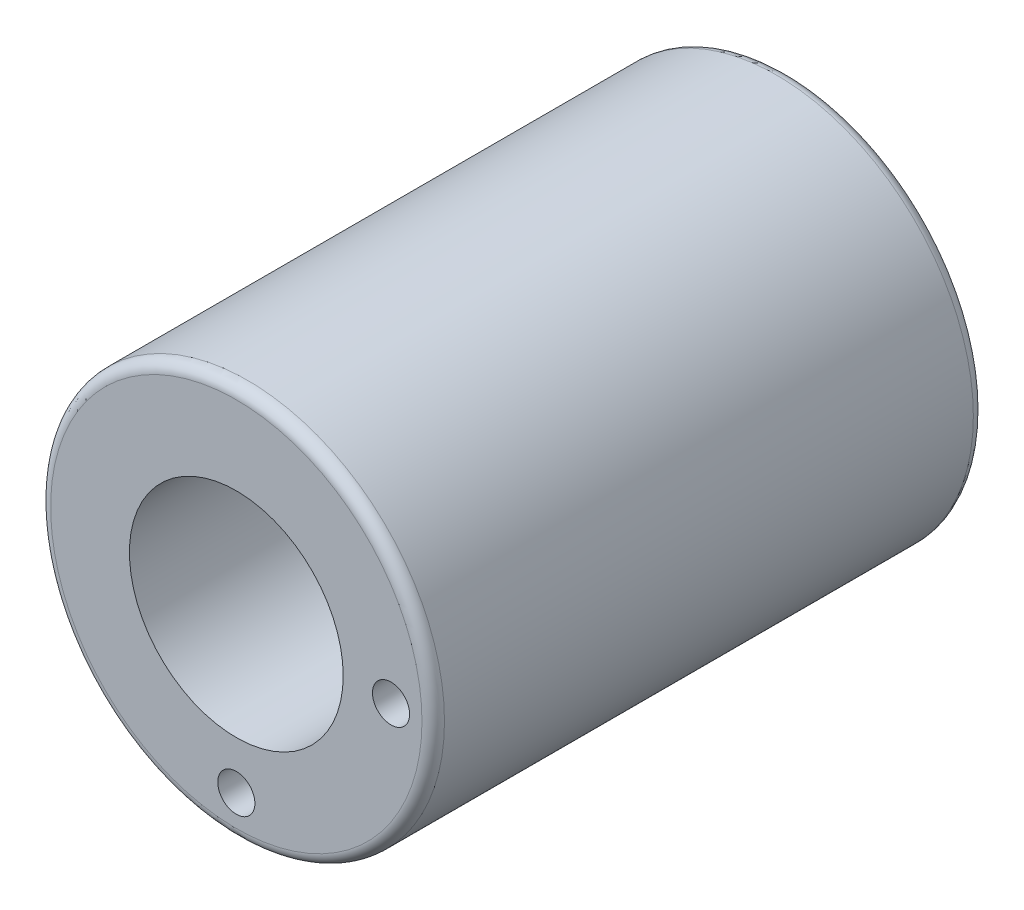
ISO-10303-21;
HEADER;
FILE_DESCRIPTION(('STEP AP214'),'2;1');
FILE_NAME('part.step','',(''),(''),'','','');
FILE_SCHEMA(('AUTOMOTIVE_DESIGN { 1 0 10303 214 1 1 1 1 }'));
ENDSEC;
DATA;
#1=APPLICATION_CONTEXT('core data for automotive mechanical design processes');
#2=APPLICATION_PROTOCOL_DEFINITION('international standard','automotive_design',2000,#1);
#3=PRODUCT_CONTEXT('',#1,'mechanical');
#4=PRODUCT('Part','Part','',(#3));
#5=PRODUCT_RELATED_PRODUCT_CATEGORY('part','',(#4));
#6=PRODUCT_DEFINITION_FORMATION('','',#4);
#7=PRODUCT_DEFINITION_CONTEXT('part definition',#1,'design');
#8=PRODUCT_DEFINITION('design','',#6,#7);
#9=PRODUCT_DEFINITION_SHAPE('','',#8);
#10=(LENGTH_UNIT() NAMED_UNIT(*) SI_UNIT(.MILLI.,.METRE.));
#11=(NAMED_UNIT(*) PLANE_ANGLE_UNIT() SI_UNIT($,.RADIAN.));
#12=(NAMED_UNIT(*) SI_UNIT($,.STERADIAN.) SOLID_ANGLE_UNIT());
#13=UNCERTAINTY_MEASURE_WITH_UNIT(LENGTH_MEASURE(1.E-05),#10,'distance_accuracy_value','');
#14=(GEOMETRIC_REPRESENTATION_CONTEXT(3) GLOBAL_UNCERTAINTY_ASSIGNED_CONTEXT((#13)) GLOBAL_UNIT_ASSIGNED_CONTEXT((#10,
#11,#12)) REPRESENTATION_CONTEXT('',''));
#15=CARTESIAN_POINT('',(0.,0.,0.));
#16=DIRECTION('',(0.,0.,1.));
#17=DIRECTION('',(1.,0.,0.));
#18=AXIS2_PLACEMENT_3D('',#15,#16,#17);
#19=CARTESIAN_POINT('',(0.,0.,24.5));
#20=DIRECTION('',(0.,0.,1.));
#21=DIRECTION('',(1.,0.,0.));
#22=AXIS2_PLACEMENT_3D('',#19,#20,#21);
#23=PLANE('',#22);
#24=CARTESIAN_POINT('',(13.75,0.,24.5));
#25=DIRECTION('',(0.,0.,1.));
#26=DIRECTION('',(1.,0.,0.));
#27=AXIS2_PLACEMENT_3D('',#24,#25,#26);
#28=CIRCLE('',#27,1.64999999999999);
#29=CARTESIAN_POINT('',(15.4,0.,24.5));
#30=VERTEX_POINT('',#29);
#31=EDGE_CURVE('E67',#30,#30,#28,.T.);
#32=ORIENTED_EDGE('',*,*,#31,.F.);
#33=EDGE_LOOP('',(#32));
#34=FACE_BOUND('',#33,.T.);
#35=CARTESIAN_POINT('',(0.,-13.75,24.5));
#36=DIRECTION('',(0.,0.,1.));
#37=DIRECTION('',(1.,0.,0.));
#38=AXIS2_PLACEMENT_3D('',#35,#36,#37);
#39=CIRCLE('',#38,1.64999999999999);
#40=CARTESIAN_POINT('',(1.64999999999999,-13.75,24.5));
#41=VERTEX_POINT('',#40);
#42=EDGE_CURVE('E66',#41,#41,#39,.T.);
#43=ORIENTED_EDGE('',*,*,#42,.F.);
#44=EDGE_LOOP('',(#43));
#45=FACE_BOUND('',#44,.T.);
#46=CARTESIAN_POINT('',(0.,0.,24.5));
#47=DIRECTION('',(0.,0.,1.));
#48=DIRECTION('',(1.,0.,0.));
#49=AXIS2_PLACEMENT_3D('',#46,#47,#48);
#50=CIRCLE('',#49,16.5);
#51=CARTESIAN_POINT('',(16.5,0.,24.5));
#52=VERTEX_POINT('',#51);
#53=EDGE_CURVE('E11',#52,#52,#50,.T.);
#54=ORIENTED_EDGE('',*,*,#53,.T.);
#55=EDGE_LOOP('',(#54));
#56=FACE_BOUND('',#55,.T.);
#57=CARTESIAN_POINT('',(0.,0.,24.5));
#58=DIRECTION('',(0.,0.,1.));
#59=DIRECTION('',(1.,0.,0.));
#60=AXIS2_PLACEMENT_3D('',#57,#58,#59);
#61=CIRCLE('',#60,9.5);
#62=CARTESIAN_POINT('',(9.5,0.,24.5));
#63=VERTEX_POINT('',#62);
#64=EDGE_CURVE('E85',#63,#63,#61,.T.);
#65=ORIENTED_EDGE('',*,*,#64,.F.);
#66=EDGE_LOOP('',(#65));
#67=FACE_BOUND('',#66,.T.);
#68=ADVANCED_FACE('F36',(#34,#45,#56,#67),#23,.T.);
#69=CARTESIAN_POINT('',(0.,0.,-24.5));
#70=DIRECTION('',(0.,0.,1.));
#71=DIRECTION('',(1.,0.,0.));
#72=AXIS2_PLACEMENT_3D('',#69,#70,#71);
#73=PLANE('',#72);
#74=CARTESIAN_POINT('',(0.,0.,-24.5));
#75=DIRECTION('',(0.,0.,1.));
#76=DIRECTION('',(1.,0.,0.));
#77=AXIS2_PLACEMENT_3D('',#74,#75,#76);
#78=CIRCLE('',#77,16.5);
#79=CARTESIAN_POINT('',(16.5,0.,-24.5));
#80=VERTEX_POINT('',#79);
#81=EDGE_CURVE('E50',#80,#80,#78,.F.);
#82=ORIENTED_EDGE('',*,*,#81,.T.);
#83=EDGE_LOOP('',(#82));
#84=FACE_BOUND('',#83,.T.);
#85=CARTESIAN_POINT('',(0.,0.,-24.5));
#86=DIRECTION('',(0.,0.,1.));
#87=DIRECTION('',(1.,0.,0.));
#88=AXIS2_PLACEMENT_3D('',#85,#86,#87);
#89=CIRCLE('',#88,9.5);
#90=CARTESIAN_POINT('',(9.5,0.,-24.5));
#91=VERTEX_POINT('',#90);
#92=EDGE_CURVE('E84',#91,#91,#89,.T.);
#93=ORIENTED_EDGE('',*,*,#92,.T.);
#94=EDGE_LOOP('',(#93));
#95=FACE_BOUND('',#94,.T.);
#96=ADVANCED_FACE('F105',(#84,#95),#73,.F.);
#97=CARTESIAN_POINT('',(0.,0.,24.5));
#98=DIRECTION('',(0.,0.,-1.));
#99=DIRECTION('',(-1.,0.,0.));
#100=AXIS2_PLACEMENT_3D('',#97,#98,#99);
#101=CYLINDRICAL_SURFACE('',#100,17.5);
#102=CARTESIAN_POINT('',(-17.5,0.,-6.5));
#103=CARTESIAN_POINT('',(-17.5000005449164,0.176082842707265,-6.50000074770926));
#104=CARTESIAN_POINT('',(-17.4973366738379,0.352155278135002,-6.49283950648984));
#105=CARTESIAN_POINT('',(-17.486753318283,0.703044903326908,-6.46426482195044));
#106=CARTESIAN_POINT('',(-17.4788320387425,0.877861643738105,-6.44284651075784));
#107=CARTESIAN_POINT('',(-17.4579514394268,1.22479386980598,-6.38598195476209));
#108=CARTESIAN_POINT('',(-17.4449947453772,1.39691071474323,-6.35054302086411));
#109=CARTESIAN_POINT('',(-17.4143827440417,1.73738363272554,-6.26596200028572));
#110=CARTESIAN_POINT('',(-17.3967256121107,1.90573821774471,-6.21681459180992));
#111=CARTESIAN_POINT('',(-17.3572230957471,2.23709286074898,-6.10539912216409));
#112=CARTESIAN_POINT('',(-17.3353875823091,2.40010449846399,-6.04316195053314));
#113=CARTESIAN_POINT('',(-17.2880490287416,2.72021162920226,-5.90599545734075));
#114=CARTESIAN_POINT('',(-17.2625446295057,2.87730490248572,-5.83106143050349));
#115=CARTESIAN_POINT('',(-17.2085140385072,3.18455243036811,-5.66910751078582));
#116=CARTESIAN_POINT('',(-17.1799883074179,3.33470773782323,-5.58208945977177));
#117=CARTESIAN_POINT('',(-17.1205990526509,3.62731113321308,-5.39653947305941));
#118=CARTESIAN_POINT('',(-17.0897346869112,3.76975641307936,-5.29800338311434));
#119=CARTESIAN_POINT('',(-17.0252346811939,4.05129807650965,-5.08617442065734));
#120=CARTESIAN_POINT('',(-16.9915385236593,4.19006863078621,-4.9724667708772));
#121=CARTESIAN_POINT('',(-16.9233143541839,4.45763362334577,-4.73409007097036));
#122=CARTESIAN_POINT('',(-16.8887863185188,4.58642777666906,-4.60942070795711));
#123=CARTESIAN_POINT('',(-16.8197845677912,4.83335188192489,-4.34980644565736));
#124=CARTESIAN_POINT('',(-16.7853108845324,4.95147696256481,-4.21485690395872));
#125=CARTESIAN_POINT('',(-16.7173639136864,5.17624644228479,-3.93555527200228));
#126=CARTESIAN_POINT('',(-16.6838902915793,5.2828947121282,-3.79120637837752));
#127=CARTESIAN_POINT('',(-16.6176223418041,5.48786535922025,-3.48826977611436));
#128=CARTESIAN_POINT('',(-16.5849012507242,5.58572200925672,-3.32935037193457));
#129=CARTESIAN_POINT('',(-16.5225337266652,5.76759245036644,-3.00328342353148));
#130=CARTESIAN_POINT('',(-16.4928860642893,5.85161178445879,-2.8361392090624));
#131=CARTESIAN_POINT('',(-16.4376051742514,6.00514775555873,-2.49464433654784));
#132=CARTESIAN_POINT('',(-16.4119724384089,6.07466261614641,-2.32029279892246));
#133=CARTESIAN_POINT('',(-16.3656100690415,6.19848225267279,-1.96572108830928));
#134=CARTESIAN_POINT('',(-16.3448780834452,6.25279432736706,-1.78550377799006));
#135=CARTESIAN_POINT('',(-16.3097586879032,6.3438203440804,-1.42780532423225));
#136=CARTESIAN_POINT('',(-16.2951508051844,6.38115091875057,-1.25050273533275));
#137=CARTESIAN_POINT('',(-16.2716273697111,6.44089881263929,-0.893101867924691));
#138=CARTESIAN_POINT('',(-16.2627093385055,6.46332262529549,-0.713004841715108));
#139=CARTESIAN_POINT('',(-16.2508716121865,6.4930292440554,-0.351394631266974));
#140=CARTESIAN_POINT('',(-16.2479510659561,6.50031419855116,-0.169881651640063));
#141=CARTESIAN_POINT('',(-16.2482108539265,6.49966505077263,0.193109165249485));
#142=CARTESIAN_POINT('',(-16.2513909577197,6.49173152326602,0.374587003580444));
#143=CARTESIAN_POINT('',(-16.2633727390578,6.4616519593851,0.725399087858757));
#144=CARTESIAN_POINT('',(-16.2718328569624,6.44036908886225,0.894819903621266));
#145=CARTESIAN_POINT('',(-16.293792665971,6.38460788212688,1.23120119134158));
#146=CARTESIAN_POINT('',(-16.3072940327803,6.35012515820263,1.39816082600241));
#147=CARTESIAN_POINT('',(-16.3389211823553,6.26829915425157,1.72839764484689));
#148=CARTESIAN_POINT('',(-16.3570457592211,6.22095922763854,1.89167577722993));
#149=CARTESIAN_POINT('',(-16.397397098282,6.11380761639349,2.21362895068428));
#150=CARTESIAN_POINT('',(-16.4196254282211,6.05399116425608,2.37230220566979));
#151=CARTESIAN_POINT('',(-16.4679944628653,5.92116893612842,2.68690229527894));
#152=CARTESIAN_POINT('',(-16.4941993088252,5.84794186705102,2.8427257631207));
#153=CARTESIAN_POINT('',(-16.5494920436118,5.6895822090298,3.14772815947756));
#154=CARTESIAN_POINT('',(-16.5785809117832,5.60444557182173,3.29690480579545));
#155=CARTESIAN_POINT('',(-16.6388656230188,5.42284991308396,3.58777051618573));
#156=CARTESIAN_POINT('',(-16.6700616945968,5.3263896627364,3.72945876520691));
#157=CARTESIAN_POINT('',(-16.7337644801799,5.12274412370838,4.00459600013006));
#158=CARTESIAN_POINT('',(-16.7662712522131,5.01555835986955,4.13804462057867));
#159=CARTESIAN_POINT('',(-16.8339612364769,4.7836475158991,4.40453645982775));
#160=CARTESIAN_POINT('',(-16.8691793795692,4.65823150207746,4.53697034088314));
#161=CARTESIAN_POINT('',(-16.9392237042501,4.39670532411969,4.79084393019783));
#162=CARTESIAN_POINT('',(-16.974050001903,4.26059842732418,4.91228697323796));
#163=CARTESIAN_POINT('',(-17.0424043391473,3.97838415942547,5.14351562739481));
#164=CARTESIAN_POINT('',(-17.0759316847514,3.83227155489014,5.25329506014132));
#165=CARTESIAN_POINT('',(-17.1407547803469,3.53104069953708,5.46032396657837));
#166=CARTESIAN_POINT('',(-17.1720514170845,3.3759260721721,5.55757843170934));
#167=CARTESIAN_POINT('',(-17.2320390070199,3.05513668014532,5.74027268018625));
#168=CARTESIAN_POINT('',(-17.2606824021551,2.88933606302989,5.82550741843563));
#169=CARTESIAN_POINT('',(-17.3139844174298,2.55055495829556,5.98159153445053));
#170=CARTESIAN_POINT('',(-17.338644614686,2.37757734661791,6.05244660859741));
#171=CARTESIAN_POINT('',(-17.3832743966534,2.02564195541856,6.17913790792001));
#172=CARTESIAN_POINT('',(-17.4032446637915,1.84668505027176,6.23497631832675));
#173=CARTESIAN_POINT('',(-17.4379037270297,1.48413749228256,6.33107402339434));
#174=CARTESIAN_POINT('',(-17.4525928325121,1.30054711155405,6.37133423067166));
#175=CARTESIAN_POINT('',(-17.4756258613195,0.939906515855139,6.43415146477865));
#176=CARTESIAN_POINT('',(-17.4842615757748,0.763016731567074,6.45752457306262));
#177=CARTESIAN_POINT('',(-17.4961520258145,0.407736983902977,6.48965024378489));
#178=CARTESIAN_POINT('',(-17.4994069812002,0.229347082105192,6.49840340344074));
#179=CARTESIAN_POINT('',(-17.5004449204997,-0.127529305567229,6.50119786509985));
#180=CARTESIAN_POINT('',(-17.4982289310215,-0.306015767039082,6.4952419272252));
#181=CARTESIAN_POINT('',(-17.4883891138409,-0.661743388413554,6.46868657524182));
#182=CARTESIAN_POINT('',(-17.480765365717,-0.838984566602506,6.44808737661747));
#183=CARTESIAN_POINT('',(-17.4607096275704,-1.18422305068389,6.3935120549145));
#184=CARTESIAN_POINT('',(-17.4484702561,-1.3523165458086,6.36007094012949));
#185=CARTESIAN_POINT('',(-17.4194883962207,-1.68502759401139,6.28012449267436));
#186=CARTESIAN_POINT('',(-17.4027444230022,-1.84964398163246,6.23361485212408));
#187=CARTESIAN_POINT('',(-17.3651776128115,-2.17423441174356,6.12795473584467));
#188=CARTESIAN_POINT('',(-17.3443558845256,-2.33420970254131,6.0688076956565));
#189=CARTESIAN_POINT('',(-17.2991300857764,-2.64864889793824,5.93832019461443));
#190=CARTESIAN_POINT('',(-17.2747246563082,-2.80311068397062,5.86697510634374));
#191=CARTESIAN_POINT('',(-17.2221731645983,-3.10993086010612,5.71041508308493));
#192=CARTESIAN_POINT('',(-17.1939396317871,-3.26210063482913,5.62485994327005));
#193=CARTESIAN_POINT('',(-17.1349931607566,-3.55877711891526,5.44201073789748));
#194=CARTESIAN_POINT('',(-17.1042793716683,-3.7032811700886,5.34471263812653));
#195=CARTESIAN_POINT('',(-17.041127457478,-3.98379841033811,5.13902751153541));
#196=CARTESIAN_POINT('',(-17.0086890866802,-4.11981038353971,5.03063890263951));
#197=CARTESIAN_POINT('',(-16.9428812136753,-4.38259363776475,4.80344091494884));
#198=CARTESIAN_POINT('',(-16.9095116783699,-4.50936458973393,4.68463116540971));
#199=CARTESIAN_POINT('',(-16.840746720705,-4.75994553550127,4.43019126589994));
#200=CARTESIAN_POINT('',(-16.8053444967494,-4.88317236981137,4.29398789743639));
#201=CARTESIAN_POINT('',(-16.7354086626862,-5.11772146513808,4.01155979701718));
#202=CARTESIAN_POINT('',(-16.7008747768932,-5.22904754193029,3.8653383020274));
#203=CARTESIAN_POINT('',(-16.6336350093248,-5.43915086844924,3.56362815928965));
#204=CARTESIAN_POINT('',(-16.6009300347488,-5.53792192086231,3.4081349901334));
#205=CARTESIAN_POINT('',(-16.5383551108375,-5.72208607380756,3.08895820353708));
#206=CARTESIAN_POINT('',(-16.5084839719185,-5.80748479763873,2.92527806727322));
#207=CARTESIAN_POINT('',(-16.4523830931262,-5.96456865418505,2.59004223581513));
#208=CARTESIAN_POINT('',(-16.4261682964247,-6.03619793853403,2.41845782723795));
#209=CARTESIAN_POINT('',(-16.3784004007256,-6.16463287731788,2.06927293691519));
#210=CARTESIAN_POINT('',(-16.3568453544398,-6.22144472594817,1.89167500422112));
#211=CARTESIAN_POINT('',(-16.3191386813526,-6.31969028209764,1.5317637222414));
#212=CARTESIAN_POINT('',(-16.3029854810672,-6.36112846814067,1.34945176278628));
#213=CARTESIAN_POINT('',(-16.2766618779046,-6.42818652406439,0.981518428151138));
#214=CARTESIAN_POINT('',(-16.2664910688141,-6.45380746796551,0.795897278552155));
#215=CARTESIAN_POINT('',(-16.252952372439,-6.48782304586582,0.434687522201518));
#216=CARTESIAN_POINT('',(-16.2491954161049,-6.4972034102156,0.259205663734996));
#217=CARTESIAN_POINT('',(-16.2473885300228,-6.50172084719679,-0.091968854793017));
#218=CARTESIAN_POINT('',(-16.2493384165458,-6.49685837836923,-0.267661507886049));
#219=CARTESIAN_POINT('',(-16.2588794133205,-6.47294399199657,-0.617904115641188));
#220=CARTESIAN_POINT('',(-16.2664699916974,-6.4538934122834,-0.792454176475806));
#221=CARTESIAN_POINT('',(-16.2870400437067,-6.40180510542366,-1.13912953173687));
#222=CARTESIAN_POINT('',(-16.300019516002,-6.36876738174746,-1.31125482676492));
#223=CARTESIAN_POINT('',(-16.3304887312187,-6.2902188920447,-1.64680082085187));
#224=CARTESIAN_POINT('',(-16.34783344805,-6.24510668437639,-1.81032832431665));
#225=CARTESIAN_POINT('',(-16.3866976470655,-6.14240614046192,-2.13296040722864));
#226=CARTESIAN_POINT('',(-16.4082185052846,-6.08481369125511,-2.29206350902943));
#227=CARTESIAN_POINT('',(-16.4548245876511,-5.95762786873597,-2.60483359814269));
#228=CARTESIAN_POINT('',(-16.4799092739297,-5.88803630604515,-2.75850140141146));
#229=CARTESIAN_POINT('',(-16.5329707465466,-5.73735627889922,-3.05959513185862));
#230=CARTESIAN_POINT('',(-16.5609485776438,-5.65626365728017,-3.20701877689566));
#231=CARTESIAN_POINT('',(-16.6511360461692,-5.3876300301302,-3.65348527991487));
#232=CARTESIAN_POINT('',(-16.7171096780831,-5.18121749268352,-3.94068764059042));
#233=CARTESIAN_POINT('',(-16.8517377088466,-4.72496668606866,-4.47759692646011));
#234=CARTESIAN_POINT('',(-16.9203929461333,-4.47511474938853,-4.7272920043602));
#235=CARTESIAN_POINT('',(-17.0219243504881,-4.06514682813456,-5.07534007343199));
#236=CARTESIAN_POINT('',(-17.0563614132408,-3.9184971113922,-5.18940675065946));
#237=CARTESIAN_POINT('',(-17.1231108215168,-3.61567024699691,-5.40475778659424));
#238=CARTESIAN_POINT('',(-17.1554239572698,-3.4594966849623,-5.50604691236609));
#239=CARTESIAN_POINT('',(-17.2170400731727,-3.13851183941782,-5.69512639805471));
#240=CARTESIAN_POINT('',(-17.2463415325804,-2.97369625494351,-5.78290994935501));
#241=CARTESIAN_POINT('',(-17.3010734473169,-2.63666186359884,-5.94414772902297));
#242=CARTESIAN_POINT('',(-17.3265055522107,-2.4644462518559,-6.01760806737651));
#243=CARTESIAN_POINT('',(-17.3735992583732,-2.10750794966822,-6.15191448347071));
#244=CARTESIAN_POINT('',(-17.395094076714,-1.92255825284795,-6.21221736538083));
#245=CARTESIAN_POINT('',(-17.4324670345157,-1.54745428940054,-6.31611105290934));
#246=CARTESIAN_POINT('',(-17.4483449367412,-1.35729980330983,-6.35970115265498));
#247=CARTESIAN_POINT('',(-17.4739589404211,-0.973513784796853,-6.4296423813128));
#248=CARTESIAN_POINT('',(-17.4836974996085,-0.779883675721763,-6.45600040881221));
#249=CARTESIAN_POINT('',(-17.4967173980399,-0.390831315589965,-6.49117790967752));
#250=CARTESIAN_POINT('',(-17.499999395275,-0.195409249191904,-6.49999917022407));
#251=CARTESIAN_POINT('',(-17.5,0.,-6.5));
#252=B_SPLINE_CURVE_WITH_KNOTS('',3,(#102,#103,#104,#105,#106,#107,#108,#109,#110,#111,#112,
#113,#114,#115,#116,#117,#118,#119,#120,#121,#122,#123,#124,#125,#126,#127,#128,#129,#130,#131,
#132,#133,#134,#135,#136,#137,#138,#139,#140,#141,#142,#143,#144,#145,#146,#147,#148,#149,#150,
#151,#152,#153,#154,#155,#156,#157,#158,#159,#160,#161,#162,#163,#164,#165,#166,#167,#168,#169,
#170,#171,#172,#173,#174,#175,#176,#177,#178,#179,#180,#181,#182,#183,#184,#185,#186,#187,#188,
#189,#190,#191,#192,#193,#194,#195,#196,#197,#198,#199,#200,#201,#202,#203,#204,#205,#206,#207,
#208,#209,#210,#211,#212,#213,#214,#215,#216,#217,#218,#219,#220,#221,#222,#223,#224,#225,#226,
#227,#228,#229,#230,#231,#232,#233,#234,#235,#236,#237,#238,#239,#240,#241,#242,#243,#244,#245,
#246,#247,#248,#249,#250,#251),.UNSPECIFIED.,.T.,.F.,(4,2,2,2,2,2,2,2,2,2,2,2,2,2,2,2,2,2,2,2,2,
2,2,2,2,2,2,2,2,2,2,2,2,2,2,2,2,2,2,2,2,2,2,2,2,2,2,2,2,2,2,2,2,2,2,2,2,2,2,2,2,2,2,2,2,2,2,2,2,
2,2,2,2,2,4),(0.,0.528065728518552,1.05631185007247,1.58428288555955,2.11245917173675,
2.6394027655801,3.16654206611569,3.69360110724278,4.22085083436694,4.76786987114784,
5.31490452688322,5.86218769865068,6.40928570686393,6.97701809830673,7.54452250865204,
8.1120963827498,8.67939729924474,9.22402301377087,9.7684113317037,10.3127223888934,
10.857012889089,11.3692976475675,11.8817528407009,12.3940745034875,12.9065922934466,
13.4284873135827,13.9505601677218,14.4726897287196,14.9948424311892,15.5514942532827,
16.1079766088393,16.6647522860938,17.2213053863615,17.7864306868629,18.3513316789183,
18.9161504218158,19.4809360709764,20.0161696800883,20.5513814246415,21.0864927457991,
21.6215961926347,22.1364753236871,22.6515243778799,23.1664335911355,23.6815385740634,
24.2114748711993,24.7415937453208,25.2717883473059,25.8020018192456,26.3625136873922,
26.9228452944603,27.4834524227868,28.0438231691799,28.6064209021444,29.1687830716697,
29.7309812897857,30.293141329387,30.8197984222105,31.3464385597541,31.8730290453881,
32.3996194003691,32.9106077196188,33.4217646958428,33.9328446077779,34.4441097273247,
35.5184731955682,36.5931753088497,37.1594535527407,37.7255199000753,38.291870692024,
38.8579793593417,39.4442740828926,40.0305935661687,40.6166781817577,41.2027030661091),.UNSPECIFIED.);
#253=CARTESIAN_POINT('',(-17.5,0.,-6.5));
#254=VERTEX_POINT('',#253);
#255=EDGE_CURVE('E77',#254,#254,#252,.T.);
#256=ORIENTED_EDGE('',*,*,#255,.T.);
#257=EDGE_LOOP('',(#256));
#258=FACE_BOUND('',#257,.T.);
#259=CARTESIAN_POINT('',(0.,0.,-23.5));
#260=DIRECTION('',(0.,0.,1.));
#261=DIRECTION('',(1.,0.,0.));
#262=AXIS2_PLACEMENT_3D('',#259,#260,#261);
#263=CIRCLE('',#262,17.5);
#264=CARTESIAN_POINT('',(17.5,0.,-23.5));
#265=VERTEX_POINT('',#264);
#266=EDGE_CURVE('E124',#265,#265,#263,.T.);
#267=ORIENTED_EDGE('',*,*,#266,.T.);
#268=EDGE_LOOP('',(#267));
#269=FACE_BOUND('',#268,.T.);
#270=CARTESIAN_POINT('',(0.,0.,23.5));
#271=DIRECTION('',(0.,0.,1.));
#272=DIRECTION('',(1.,0.,0.));
#273=AXIS2_PLACEMENT_3D('',#270,#271,#272);
#274=CIRCLE('',#273,17.5);
#275=CARTESIAN_POINT('',(17.5,0.,23.5));
#276=VERTEX_POINT('',#275);
#277=EDGE_CURVE('E120',#276,#276,#274,.F.);
#278=ORIENTED_EDGE('',*,*,#277,.T.);
#279=EDGE_LOOP('',(#278));
#280=FACE_BOUND('',#279,.T.);
#281=ADVANCED_FACE('F87',(#258,#269,#280),#101,.T.);
#282=CARTESIAN_POINT('',(0.,0.,24.5));
#283=DIRECTION('',(0.,0.,-1.));
#284=DIRECTION('',(-1.,0.,0.));
#285=AXIS2_PLACEMENT_3D('',#282,#283,#284);
#286=CYLINDRICAL_SURFACE('',#285,9.5);
#287=CARTESIAN_POINT('',(-9.5,0.,6.5));
#288=CARTESIAN_POINT('',(-9.49999963939393,-0.162382732582079,6.49999961843155));
#289=CARTESIAN_POINT('',(-9.49582756567795,-0.324771090721264,6.49390641966194));
#290=CARTESIAN_POINT('',(-9.47924275964762,-0.648217166872034,6.46963066907145));
#291=CARTESIAN_POINT('',(-9.46682966695249,-0.809274826380147,6.45144758855848));
#292=CARTESIAN_POINT('',(-9.43405934814387,-1.12886719070627,6.40326382566367));
#293=CARTESIAN_POINT('',(-9.41369822495001,-1.28740061809343,6.37325734596163));
#294=CARTESIAN_POINT('',(-9.3655135780759,-1.60071365547625,6.30186773992507));
#295=CARTESIAN_POINT('',(-9.33769003060739,-1.75549325350395,6.26048457732464));
#296=CARTESIAN_POINT('',(-9.27535887815943,-2.0595311271418,6.16712942113513));
#297=CARTESIAN_POINT('',(-9.24088644217092,-2.20881373700881,6.11521307048094));
#298=CARTESIAN_POINT('',(-9.16587888353034,-2.50191765796065,6.0012637172602));
#299=CARTESIAN_POINT('',(-9.1253413923922,-2.64573680785549,5.93922676160131));
#300=CARTESIAN_POINT('',(-8.99581335969356,-3.0678593956413,5.73891154536749));
#301=CARTESIAN_POINT('',(-8.89884999187447,-3.33709697353655,5.58634497464884));
#302=CARTESIAN_POINT('',(-8.68143012610851,-3.86945251432102,5.23337724451132));
#303=CARTESIAN_POINT('',(-8.55966519114347,-4.13001255002994,5.02997422543474));
#304=CARTESIAN_POINT('',(-8.30777141370154,-4.61581972575499,4.58825939460817));
#305=CARTESIAN_POINT('',(-8.17763044015691,-4.84101394539249,4.34989628108316));
#306=CARTESIAN_POINT('',(-7.97287762125402,-5.16754298769396,3.9475312355583));
#307=CARTESIAN_POINT('',(-7.89768063004195,-5.2814401793141,3.79382946169835));
#308=CARTESIAN_POINT('',(-7.75000974172531,-5.4958408332092,3.47598580237812));
#309=CARTESIAN_POINT('',(-7.67753651282712,-5.59634102407143,3.3118413813312));
#310=CARTESIAN_POINT('',(-7.53790797482918,-5.78303721228807,2.97383686529429));
#311=CARTESIAN_POINT('',(-7.47074432432306,-5.86925588929076,2.79999277237622));
#312=CARTESIAN_POINT('',(-7.34433915999691,-6.02668044855563,2.44278308069776));
#313=CARTESIAN_POINT('',(-7.28509773993949,-6.09788615313934,2.25941736928106));
#314=CARTESIAN_POINT('',(-7.19376430887688,-6.20508797565599,1.94062725074601));
#315=CARTESIAN_POINT('',(-7.15886810073783,-6.2452304726254,1.80738887700641));
#316=CARTESIAN_POINT('',(-7.09547422800057,-6.31716280169508,1.5372000705353));
#317=CARTESIAN_POINT('',(-7.06697472373868,-6.34895503574279,1.40025071779599));
#318=CARTESIAN_POINT('',(-7.01738732242688,-6.40372098699903,1.12348744467446));
#319=CARTESIAN_POINT('',(-6.99628825419198,-6.42670800083116,0.983678182029345));
#320=CARTESIAN_POINT('',(-6.96225938608702,-6.46355762022178,0.701863932181415));
#321=CARTESIAN_POINT('',(-6.94932959996928,-6.47742021042008,0.559858941282687));
#322=CARTESIAN_POINT('',(-6.93214440209214,-6.4958091317708,0.274000106052936));
#323=CARTESIAN_POINT('',(-6.92793260601035,-6.50028852055868,0.130140571460392));
#324=CARTESIAN_POINT('',(-6.92850094181639,-6.49968260827878,-0.157538552978103));
#325=CARTESIAN_POINT('',(-6.93328107111245,-6.49459730996785,-0.301358142835556));
#326=CARTESIAN_POINT('',(-6.95162906209511,-6.474954362803,-0.587871529022286));
#327=CARTESIAN_POINT('',(-6.96520237201249,-6.4603908412419,-0.730564571826696));
#328=CARTESIAN_POINT('',(-7.00055099406979,-6.42206750040779,-1.01364501332579));
#329=CARTESIAN_POINT('',(-7.02232649046224,-6.39830747454572,-1.15403236015178));
#330=CARTESIAN_POINT('',(-7.09590032894675,-6.31691460301856,-1.55499877695173));
#331=CARTESIAN_POINT('',(-7.15718930581977,-6.24793728277487,-1.81162568141135));
#332=CARTESIAN_POINT('',(-7.29913848957638,-6.0814822690683,-2.30971073402497));
#333=CARTESIAN_POINT('',(-7.37981378892566,-5.9839823575338,-2.55115687810562));
#334=CARTESIAN_POINT('',(-7.5317311367293,-5.79086589678811,-2.95857373500404));
#335=CARTESIAN_POINT('',(-7.60026882827728,-5.70090327343732,-3.12829290691355));
#336=CARTESIAN_POINT('',(-7.74174632605736,-5.50724425419994,-3.457861434245));
#337=CARTESIAN_POINT('',(-7.81468779038382,-5.40354266758806,-3.61770702569035));
#338=CARTESIAN_POINT('',(-7.96275331400565,-5.18288034805108,-3.92733424940176));
#339=CARTESIAN_POINT('',(-8.0378808461801,-5.06589755254017,-4.0770984574465));
#340=CARTESIAN_POINT('',(-8.18811210263608,-4.81930112161301,-4.36581852509611));
#341=CARTESIAN_POINT('',(-8.26321582868895,-4.68968899538391,-4.50477567256961));
#342=CARTESIAN_POINT('',(-8.41219426989441,-4.41694046917661,-4.77257863724429));
#343=CARTESIAN_POINT('',(-8.48605061667927,-4.27368764200382,-4.9013162659108));
#344=CARTESIAN_POINT('',(-8.62992365325566,-3.9751562037624,-5.14639865890722));
#345=CARTESIAN_POINT('',(-8.69994071579384,-3.81987876367742,-5.26274462735015));
#346=CARTESIAN_POINT('',(-8.83422596945445,-3.49811267806802,-5.4818820015174));
#347=CARTESIAN_POINT('',(-8.89850372055105,-3.33164351742925,-5.58469608807038));
#348=CARTESIAN_POINT('',(-9.01968437949444,-2.98805071788421,-5.77582611772718));
#349=CARTESIAN_POINT('',(-9.07658950506486,-2.8109303065109,-5.86414642277634));
#350=CARTESIAN_POINT('',(-9.16973761357126,-2.48749395276479,-6.00719051653547));
#351=CARTESIAN_POINT('',(-9.20776410995497,-2.34305789722817,-6.06502120985405));
#352=CARTESIAN_POINT('',(-9.277610651814,-2.0490850789291,-6.17054498390938));
#353=CARTESIAN_POINT('',(-9.30943203595863,-1.89954942453318,-6.21824025142739));
#354=CARTESIAN_POINT('',(-9.3662009017713,-1.59626727491811,-6.30291247568549));
#355=CARTESIAN_POINT('',(-9.39115158956954,-1.44252278065377,-6.33989443208746));
#356=CARTESIAN_POINT('',(-9.4336493839864,-1.13174766083476,-6.40267719588412));
#357=CARTESIAN_POINT('',(-9.45119632685404,-0.974716962678684,-6.42847775597666));
#358=CARTESIAN_POINT('',(-9.47852648107985,-0.657947949694185,-6.46859189537231));
#359=CARTESIAN_POINT('',(-9.48828186576759,-0.498201992868945,-6.48286430522096));
#360=CARTESIAN_POINT('',(-9.49968854196423,-0.177800814158339,-6.49954765114893));
#361=CARTESIAN_POINT('',(-9.50133983906367,-0.0171455929002971,-6.50195859541076));
#362=CARTESIAN_POINT('',(-9.49649790693525,0.30378295546854,-6.49488098284178));
#363=CARTESIAN_POINT('',(-9.49000440642394,0.46405626968079,-6.48539202965424));
#364=CARTESIAN_POINT('',(-9.4690305616937,0.782937346074088,-6.45466233353511));
#365=CARTESIAN_POINT('',(-9.45455043051992,0.941545152567923,-6.4334219040767));
#366=CARTESIAN_POINT('',(-9.41897323586445,1.24710326386551,-6.38101905213133));
#367=CARTESIAN_POINT('',(-9.39829147190785,1.39420948172951,-6.35047788824122));
#368=CARTESIAN_POINT('',(-9.35053057381134,1.68502287438303,-6.2795786477198));
#369=CARTESIAN_POINT('',(-9.32344925283434,1.82872886875051,-6.2392172151963));
#370=CARTESIAN_POINT('',(-9.2634181603976,2.11187511664282,-6.14914991839208));
#371=CARTESIAN_POINT('',(-9.23046999690623,2.25131652675399,-6.09944661429949));
#372=CARTESIAN_POINT('',(-9.15929448944327,2.52535199450706,-5.99118768900903));
#373=CARTESIAN_POINT('',(-9.12106520104646,2.65994424364733,-5.93262880657419));
#374=CARTESIAN_POINT('',(-8.9930552150148,3.07624672164995,-5.73461195412467));
#375=CARTESIAN_POINT('',(-8.89474967400149,3.34824766886423,-5.57986148419218));
#376=CARTESIAN_POINT('',(-8.6833832924515,3.86349564844335,-5.23636515190285));
#377=CARTESIAN_POINT('',(-8.57031162164002,4.10672132343983,-5.04759429816077));
#378=CARTESIAN_POINT('',(-8.38533545493315,4.4675002930524,-4.72475702060377));
#379=CARTESIAN_POINT('',(-8.31584250280339,4.59528602550513,-4.60054219386948));
#380=CARTESIAN_POINT('',(-8.17581298788128,4.84003586464702,-4.34231533766865));
#381=CARTESIAN_POINT('',(-8.10527618651714,4.95699745174829,-4.20830104006358));
#382=CARTESIAN_POINT('',(-7.96477181448921,5.17974547952447,-3.9308907354893));
#383=CARTESIAN_POINT('',(-7.89480454271191,5.28552636277606,-3.78749011981314));
#384=CARTESIAN_POINT('',(-7.75724617599154,5.48542105618052,-3.49170569431472));
#385=CARTESIAN_POINT('',(-7.68965474214229,5.57953653524673,-3.33932317410384));
#386=CARTESIAN_POINT('',(-7.56741140027068,5.74398493779949,-3.04647508880506));
#387=CARTESIAN_POINT('',(-7.51222614088646,5.81581792030137,-2.90707391582724));
#388=CARTESIAN_POINT('',(-7.40655275667287,5.94981152351382,-2.62193718837501));
#389=CARTESIAN_POINT('',(-7.35606507288072,6.01197123640625,-2.47620104101515));
#390=CARTESIAN_POINT('',(-7.26141951916768,6.12595050505268,-2.17899560988863));
#391=CARTESIAN_POINT('',(-7.21725241650864,6.17778518733432,-2.02753510565293));
#392=CARTESIAN_POINT('',(-7.13680768974552,6.27054636616427,-1.71933579720058));
#393=CARTESIAN_POINT('',(-7.1005251590257,6.31147965031515,-1.56260034616165));
#394=CARTESIAN_POINT('',(-7.04282014129867,6.37575211370469,-1.2719947973532));
#395=CARTESIAN_POINT('',(-7.01991585172109,6.40090541333003,-1.13881908847077));
#396=CARTESIAN_POINT('',(-6.98137228881104,6.44292308179983,-0.870178074005729));
#397=CARTESIAN_POINT('',(-6.96572943012647,6.45979154154678,-0.734713932660038));
#398=CARTESIAN_POINT('',(-6.94229259677503,6.48497277827839,-0.462397889248038));
#399=CARTESIAN_POINT('',(-6.93449365262892,6.49329097232173,-0.325546921387895));
#400=CARTESIAN_POINT('',(-6.92703814696774,6.50124388583538,-0.0513666233139906));
#401=CARTESIAN_POINT('',(-6.92738173301577,6.50087844793647,0.0859627155239592));
#402=CARTESIAN_POINT('',(-6.93620024362168,6.49146909880273,0.360025209246555));
#403=CARTESIAN_POINT('',(-6.94467296599751,6.48242753792849,0.49675851551931));
#404=CARTESIAN_POINT('',(-6.96939453271143,6.45583840650325,0.768656179712952));
#405=CARTESIAN_POINT('',(-6.98564332628183,6.43829089148513,0.903820547871076));
#406=CARTESIAN_POINT('',(-7.04523924606988,6.37324001750305,1.30593570386633));
#407=CARTESIAN_POINT('',(-7.09943016828788,6.31333379839836,1.5693614953736));
#408=CARTESIAN_POINT('',(-7.25034641795031,6.139968705142,2.16190382476803));
#409=CARTESIAN_POINT('',(-7.35507765388969,6.0156136875608,2.48575472849152));
#410=CARTESIAN_POINT('',(-7.52826575336634,5.79517242035286,2.94878775121605));
#411=CARTESIAN_POINT('',(-7.58875527417519,5.7159306373188,3.09950054510827));
#412=CARTESIAN_POINT('',(-7.71337049173059,5.54661556904394,3.39319172809961));
#413=CARTESIAN_POINT('',(-7.7774959466553,5.45654300370061,3.53617063033805));
#414=CARTESIAN_POINT('',(-7.90908137345165,5.26405856896777,3.8169725697823));
#415=CARTESIAN_POINT('',(-7.97658300445315,5.1614284355108,3.9546257616716));
#416=CARTESIAN_POINT('',(-8.1120948626316,4.94571975230192,4.22128736829354));
#417=CARTESIAN_POINT('',(-8.18010521183077,4.83263861673602,4.35029362988517));
#418=CARTESIAN_POINT('',(-8.31517589400196,4.59634336648594,4.59924818857071));
#419=CARTESIAN_POINT('',(-8.38223609697773,4.47312788064695,4.71919525575071));
#420=CARTESIAN_POINT('',(-8.51403897040575,4.21685997033651,4.9495229193914));
#421=CARTESIAN_POINT('',(-8.57878127640612,4.08380600891769,5.05990201528693));
#422=CARTESIAN_POINT('',(-8.71333467038251,3.78913261000617,5.28501998725565));
#423=CARTESIAN_POINT('',(-8.78260833960206,3.62610754773808,5.39825038311119));
#424=CARTESIAN_POINT('',(-8.91451593870646,3.28849962047707,5.61030118948024));
#425=CARTESIAN_POINT('',(-8.97715294204678,3.11392216681386,5.70912827823213));
#426=CARTESIAN_POINT('',(-9.0939243148948,2.75431153986733,5.89103694628667));
#427=CARTESIAN_POINT('',(-9.14806928227372,2.5692917970535,5.97413817831193));
#428=CARTESIAN_POINT('',(-9.2462077086988,2.18997012253132,6.1233585055586));
#429=CARTESIAN_POINT('',(-9.2902055093682,1.99567220374837,6.1894848651178));
#430=CARTESIAN_POINT('',(-9.35618174420974,1.65332901170502,6.28801073281071));
#431=CARTESIAN_POINT('',(-9.38089592556316,1.50702703958128,6.32469353223601));
#432=CARTESIAN_POINT('',(-9.42364305626784,1.21130216931605,6.38792564391511));
#433=CARTESIAN_POINT('',(-9.44167741558989,1.06187993683856,6.41447709472059));
#434=CARTESIAN_POINT('',(-9.47068159671406,0.760941117664861,6.45709326048755));
#435=CARTESIAN_POINT('',(-9.48165486351868,0.609425589170682,6.47316308932948));
#436=CARTESIAN_POINT('',(-9.4963145395355,0.30527509244026,6.49461708552083));
#437=CARTESIAN_POINT('',(-9.50000033897029,0.152640031599823,6.50000035867496));
#438=CARTESIAN_POINT('',(-9.5,0.,6.5));
#439=B_SPLINE_CURVE_WITH_KNOTS('',3,(#287,#288,#289,#290,#291,#292,#293,#294,#295,#296,#297,
#298,#299,#300,#301,#302,#303,#304,#305,#306,#307,#308,#309,#310,#311,#312,#313,#314,#315,#316,
#317,#318,#319,#320,#321,#322,#323,#324,#325,#326,#327,#328,#329,#330,#331,#332,#333,#334,#335,
#336,#337,#338,#339,#340,#341,#342,#343,#344,#345,#346,#347,#348,#349,#350,#351,#352,#353,#354,
#355,#356,#357,#358,#359,#360,#361,#362,#363,#364,#365,#366,#367,#368,#369,#370,#371,#372,#373,
#374,#375,#376,#377,#378,#379,#380,#381,#382,#383,#384,#385,#386,#387,#388,#389,#390,#391,#392,
#393,#394,#395,#396,#397,#398,#399,#400,#401,#402,#403,#404,#405,#406,#407,#408,#409,#410,#411,
#412,#413,#414,#415,#416,#417,#418,#419,#420,#421,#422,#423,#424,#425,#426,#427,#428,#429,#430,
#431,#432,#433,#434,#435,#436,#437,#438),.UNSPECIFIED.,.T.,.F.,(4,2,2,2,2,2,2,2,2,2,2,2,2,2,2,2,
2,2,2,2,2,2,2,2,2,2,2,2,2,2,2,2,2,2,2,2,2,2,2,2,2,2,2,2,2,2,2,2,2,2,2,2,2,2,2,2,2,2,2,2,2,2,2,2,
2,2,2,2,2,2,2,2,2,2,2,4),(0.,0.486991622713202,0.97400454303368,1.46125655620918,
1.94851012263568,2.43325376387474,2.91818720055335,3.88720092038155,4.94029283598697,
5.99494585384688,6.61099731583351,7.22719893688705,7.8424124221714,8.45763318809607,
8.88764049698498,9.31752397876403,9.74675571683071,10.1759881774714,10.6073629272389,
11.0387375526708,11.4703797126091,11.9020315694627,12.716926139073,13.5324571801918,
14.1435663854285,14.7549071361146,15.3672787231799,15.979577222243,16.597672863584,
17.2157083889017,17.8326944602943,18.4494945060654,18.9295033218671,19.4094084673898,
19.8890892898233,20.3687807209541,20.8501777498167,21.3315744465923,21.8129871779501,
22.2943870681381,22.7488670397392,23.2035025400015,23.6580136262517,24.1126925044082,
25.0927505916622,26.0735315864896,26.6468764227484,27.2203543852823,27.7941160704536,
28.3677955753175,28.8661089012069,29.3644689646983,29.8620934548519,30.3594073778596,
30.7713378106103,31.1830646346329,31.5945304462254,32.0060037146174,32.4173655464136,
32.828724692585,33.6518791474771,34.7328407963661,35.2745598646517,35.8162429459852,
36.3692293445389,36.9223529325918,37.4755514805172,38.028836631359,38.6586459594973,
39.2881623347881,39.9168867268107,40.5453416081686,41.0033965647293,41.4613547802897,
41.9190893950715,42.3768623090863),.UNSPECIFIED.);
#440=CARTESIAN_POINT('',(-9.5,0.,6.5));
#441=VERTEX_POINT('',#440);
#442=EDGE_CURVE('E40',#441,#441,#439,.T.);
#443=ORIENTED_EDGE('',*,*,#442,.F.);
#444=EDGE_LOOP('',(#443));
#445=FACE_BOUND('',#444,.T.);
#446=ORIENTED_EDGE('',*,*,#64,.T.);
#447=EDGE_LOOP('',(#446));
#448=FACE_BOUND('',#447,.T.);
#449=ORIENTED_EDGE('',*,*,#92,.F.);
#450=EDGE_LOOP('',(#449));
#451=FACE_BOUND('',#450,.T.);
#452=ADVANCED_FACE('F97',(#445,#448,#451),#286,.F.);
#453=CARTESIAN_POINT('',(0.,0.,-23.5));
#454=DIRECTION('',(0.,0.,1.));
#455=DIRECTION('',(1.,0.,0.));
#456=AXIS2_PLACEMENT_3D('',#453,#454,#455);
#457=TOROIDAL_SURFACE('',#456,16.5,1.);
#458=ORIENTED_EDGE('',*,*,#81,.F.);
#459=EDGE_LOOP('',(#458));
#460=FACE_BOUND('',#459,.T.);
#461=ORIENTED_EDGE('',*,*,#266,.F.);
#462=EDGE_LOOP('',(#461));
#463=FACE_BOUND('',#462,.T.);
#464=ADVANCED_FACE('F102',(#460,#463),#457,.T.);
#465=CARTESIAN_POINT('',(0.,0.,23.5));
#466=DIRECTION('',(0.,0.,1.));
#467=DIRECTION('',(1.,0.,0.));
#468=AXIS2_PLACEMENT_3D('',#465,#466,#467);
#469=TOROIDAL_SURFACE('',#468,16.5,1.);
#470=ORIENTED_EDGE('',*,*,#277,.F.);
#471=EDGE_LOOP('',(#470));
#472=FACE_BOUND('',#471,.T.);
#473=ORIENTED_EDGE('',*,*,#53,.F.);
#474=EDGE_LOOP('',(#473));
#475=FACE_BOUND('',#474,.T.);
#476=ADVANCED_FACE('F38',(#472,#475),#469,.T.);
#477=CARTESIAN_POINT('',(-17.5,0.,0.));
#478=DIRECTION('',(1.,0.,0.));
#479=DIRECTION('',(0.,0.,-1.));
#480=AXIS2_PLACEMENT_3D('',#477,#478,#479);
#481=CYLINDRICAL_SURFACE('',#480,6.5);
#482=ORIENTED_EDGE('',*,*,#442,.T.);
#483=EDGE_LOOP('',(#482));
#484=FACE_BOUND('',#483,.T.);
#485=ORIENTED_EDGE('',*,*,#255,.F.);
#486=EDGE_LOOP('',(#485));
#487=FACE_BOUND('',#486,.T.);
#488=ADVANCED_FACE('F90',(#484,#487),#481,.F.);
#489=CARTESIAN_POINT('',(0.,-13.75,14.5));
#490=DIRECTION('',(0.,0.,1.));
#491=DIRECTION('',(1.,0.,0.));
#492=AXIS2_PLACEMENT_3D('',#489,#490,#491);
#493=CONICAL_SURFACE('',#492,1.65,1.02974425867665);
#494=CARTESIAN_POINT('',(0.,-13.75,13.5085799786045));
#495=VERTEX_POINT('',#494);
#496=VERTEX_LOOP('',#495);
#497=FACE_BOUND('',#496,.T.);
#498=CARTESIAN_POINT('',(0.,-13.75,14.5));
#499=DIRECTION('',(0.,0.,1.));
#500=DIRECTION('',(1.,0.,0.));
#501=AXIS2_PLACEMENT_3D('',#498,#499,#500);
#502=CIRCLE('',#501,1.65);
#503=CARTESIAN_POINT('',(1.65,-13.75,14.5));
#504=VERTEX_POINT('',#503);
#505=EDGE_CURVE('E70',#504,#504,#502,.T.);
#506=ORIENTED_EDGE('',*,*,#505,.T.);
#507=EDGE_LOOP('',(#506));
#508=FACE_BOUND('',#507,.T.);
#509=ADVANCED_FACE('F94',(#497,#508),#493,.F.);
#510=CARTESIAN_POINT('',(0.,-13.75,24.5));
#511=DIRECTION('',(0.,0.,1.));
#512=DIRECTION('',(1.,0.,0.));
#513=AXIS2_PLACEMENT_3D('',#510,#511,#512);
#514=CYLINDRICAL_SURFACE('',#513,1.64999999999999);
#515=ORIENTED_EDGE('',*,*,#505,.F.);
#516=EDGE_LOOP('',(#515));
#517=FACE_BOUND('',#516,.T.);
#518=ORIENTED_EDGE('',*,*,#42,.T.);
#519=EDGE_LOOP('',(#518));
#520=FACE_BOUND('',#519,.T.);
#521=ADVANCED_FACE('F60',(#517,#520),#514,.F.);
#522=CARTESIAN_POINT('',(13.75,0.,14.5));
#523=DIRECTION('',(0.,0.,1.));
#524=DIRECTION('',(1.,0.,0.));
#525=AXIS2_PLACEMENT_3D('',#522,#523,#524);
#526=CONICAL_SURFACE('',#525,1.65,1.02974425867665);
#527=CARTESIAN_POINT('',(13.75,0.,13.5085799786045));
#528=VERTEX_POINT('',#527);
#529=VERTEX_LOOP('',#528);
#530=FACE_BOUND('',#529,.T.);
#531=CARTESIAN_POINT('',(13.75,0.,14.5));
#532=DIRECTION('',(0.,0.,1.));
#533=DIRECTION('',(1.,0.,0.));
#534=AXIS2_PLACEMENT_3D('',#531,#532,#533);
#535=CIRCLE('',#534,1.65);
#536=CARTESIAN_POINT('',(15.4,0.,14.5));
#537=VERTEX_POINT('',#536);
#538=EDGE_CURVE('E64',#537,#537,#535,.T.);
#539=ORIENTED_EDGE('',*,*,#538,.T.);
#540=EDGE_LOOP('',(#539));
#541=FACE_BOUND('',#540,.T.);
#542=ADVANCED_FACE('F56',(#530,#541),#526,.F.);
#543=CARTESIAN_POINT('',(13.75,0.,24.5));
#544=DIRECTION('',(0.,0.,1.));
#545=DIRECTION('',(1.,0.,0.));
#546=AXIS2_PLACEMENT_3D('',#543,#544,#545);
#547=CYLINDRICAL_SURFACE('',#546,1.64999999999999);
#548=ORIENTED_EDGE('',*,*,#538,.F.);
#549=EDGE_LOOP('',(#548));
#550=FACE_BOUND('',#549,.T.);
#551=ORIENTED_EDGE('',*,*,#31,.T.);
#552=EDGE_LOOP('',(#551));
#553=FACE_BOUND('',#552,.T.);
#554=ADVANCED_FACE('F59',(#550,#553),#547,.F.);
#555=CLOSED_SHELL('',(#68,#96,#281,#452,#464,#476,#488,#509,#521,#542,#554));
#556=MANIFOLD_SOLID_BREP('B2',#555);
#557=ADVANCED_BREP_SHAPE_REPRESENTATION('',(#18,#556),#14);
#558=SHAPE_DEFINITION_REPRESENTATION(#9,#557);
ENDSEC;
END-ISO-10303-21;
